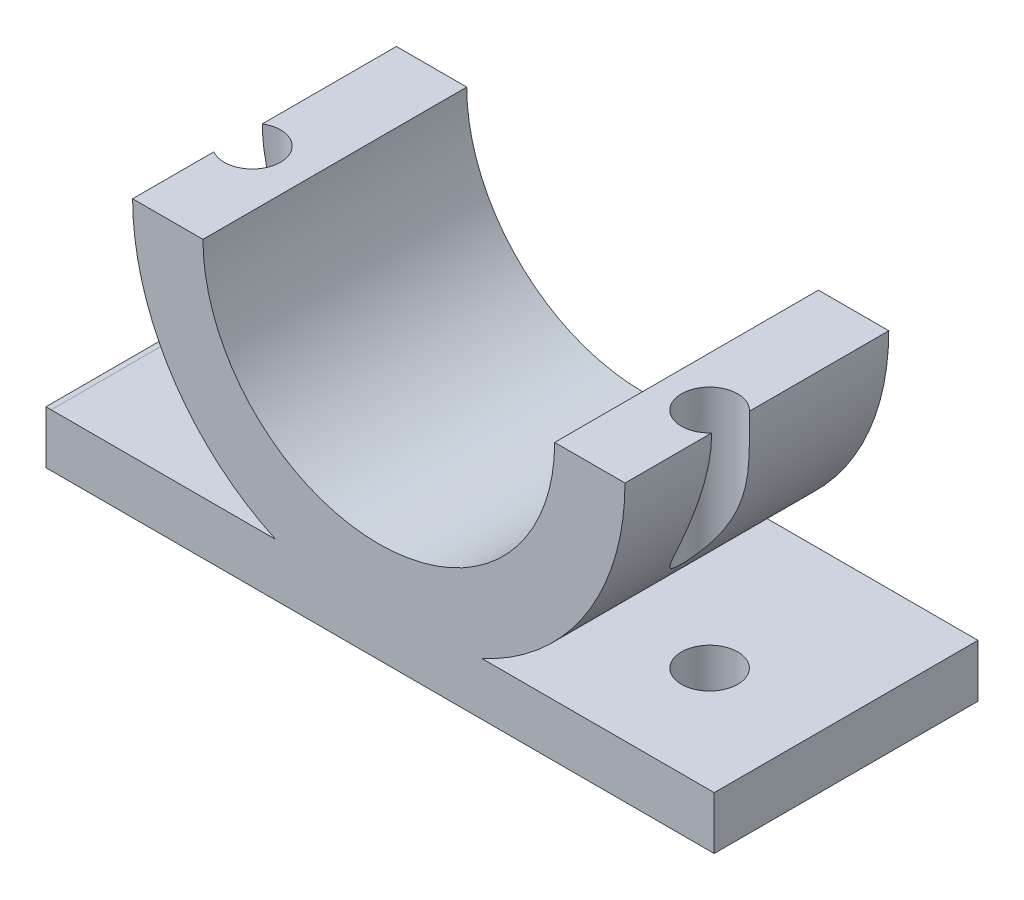
ISO-10303-21;
HEADER;
FILE_DESCRIPTION(('STEP AP214'),'2;1');
FILE_NAME('part.step','',(''),(''),'','','');
FILE_SCHEMA(('AUTOMOTIVE_DESIGN { 1 0 10303 214 1 1 1 1 }'));
ENDSEC;
DATA;
#1=APPLICATION_CONTEXT('core data for automotive mechanical design processes');
#2=APPLICATION_PROTOCOL_DEFINITION('international standard','automotive_design',2000,#1);
#3=PRODUCT_CONTEXT('',#1,'mechanical');
#4=PRODUCT('Part','Part','',(#3));
#5=PRODUCT_RELATED_PRODUCT_CATEGORY('part','',(#4));
#6=PRODUCT_DEFINITION_FORMATION('','',#4);
#7=PRODUCT_DEFINITION_CONTEXT('part definition',#1,'design');
#8=PRODUCT_DEFINITION('design','',#6,#7);
#9=PRODUCT_DEFINITION_SHAPE('','',#8);
#10=(LENGTH_UNIT() NAMED_UNIT(*) SI_UNIT(.MILLI.,.METRE.));
#11=(NAMED_UNIT(*) PLANE_ANGLE_UNIT() SI_UNIT($,.RADIAN.));
#12=(NAMED_UNIT(*) SI_UNIT($,.STERADIAN.) SOLID_ANGLE_UNIT());
#13=UNCERTAINTY_MEASURE_WITH_UNIT(LENGTH_MEASURE(1.E-05),#10,'distance_accuracy_value','');
#14=(GEOMETRIC_REPRESENTATION_CONTEXT(3) GLOBAL_UNCERTAINTY_ASSIGNED_CONTEXT((#13)) GLOBAL_UNIT_ASSIGNED_CONTEXT((#10,
#11,#12)) REPRESENTATION_CONTEXT('',''));
#15=CARTESIAN_POINT('',(0.,0.,0.));
#16=DIRECTION('',(0.,0.,1.));
#17=DIRECTION('',(1.,0.,0.));
#18=AXIS2_PLACEMENT_3D('',#15,#16,#17);
#19=CARTESIAN_POINT('',(0.,0.,15.));
#20=DIRECTION('',(0.,0.,-1.));
#21=DIRECTION('',(-1.,0.,0.));
#22=AXIS2_PLACEMENT_3D('',#19,#20,#21);
#23=CYLINDRICAL_SURFACE('',#22,14.);
#24=DIRECTION('',(0.,0.,-1.));
#25=VECTOR('',#24,1.);
#26=CARTESIAN_POINT('',(-14.,0.,15.));
#27=LINE('',#26,#25);
#28=CARTESIAN_POINT('',(-14.,0.,15.));
#29=VERTEX_POINT('',#28);
#30=CARTESIAN_POINT('',(-14.,0.,10.3798664609365));
#31=VERTEX_POINT('',#30);
#32=EDGE_CURVE('E152',#29,#31,#27,.T.);
#33=ORIENTED_EDGE('',*,*,#32,.T.);
#34=CARTESIAN_POINT('',(-14.,0.,10.3798664609365));
#35=CARTESIAN_POINT('',(-14.0000011574879,-0.133534707204342,10.3798439400469));
#36=CARTESIAN_POINT('',(-13.998089519456,-0.267066187434586,10.3809873730725));
#37=CARTESIAN_POINT('',(-13.9904498870322,-0.533971822410047,10.3854404779591));
#38=CARTESIAN_POINT('',(-13.9847222471957,-0.667345990618352,10.388749948567));
#39=CARTESIAN_POINT('',(-13.9694633795974,-0.933749242228249,10.3973675194615));
#40=CARTESIAN_POINT('',(-13.9599339159343,-1.06677845691807,10.402674692722));
#41=CARTESIAN_POINT('',(-13.9370873397942,-1.33243079980402,10.4149730651283));
#42=CARTESIAN_POINT('',(-13.9237701410927,-1.46505391868624,10.4219643026097));
#43=CARTESIAN_POINT('',(-13.8775966092046,-1.86707626292814,10.4451779981575));
#44=CARTESIAN_POINT('',(-13.8387989737457,-2.13569561566853,10.4634551517566));
#45=CARTESIAN_POINT('',(-13.7456949377816,-2.67010251195442,10.5012683347799));
#46=CARTESIAN_POINT('',(-13.6913893462134,-2.93589020245718,10.5208042985001));
#47=CARTESIAN_POINT('',(-13.5673032964662,-3.46439694041123,10.5562372083197));
#48=CARTESIAN_POINT('',(-13.4975060780449,-3.72711233743451,10.5721301749501));
#49=CARTESIAN_POINT('',(-13.3424959092101,-4.24874456039966,10.5946580252902));
#50=CARTESIAN_POINT('',(-13.2572690168224,-4.5076577200705,10.6012844883214));
#51=CARTESIAN_POINT('',(-13.1186644156227,-4.89069257240535,10.5990597889276));
#52=CARTESIAN_POINT('',(-13.0709177106255,-5.01690169281438,10.5963316471661));
#53=CARTESIAN_POINT('',(-12.9718749843762,-5.26769594886824,10.5858345572495));
#54=CARTESIAN_POINT('',(-12.9205797693436,-5.39228144580493,10.5780667507648));
#55=CARTESIAN_POINT('',(-12.8147208782103,-5.63923253301327,10.5562838171232));
#56=CARTESIAN_POINT('',(-12.7601637075649,-5.76160194677408,10.5422807875574));
#57=CARTESIAN_POINT('',(-12.6480262114857,-6.0037660911204,10.5065336869667));
#58=CARTESIAN_POINT('',(-12.5904476654659,-6.12356227987078,10.4847941296349));
#59=CARTESIAN_POINT('',(-12.4945146449322,-6.31617334121338,10.4414715116981));
#60=CARTESIAN_POINT('',(-12.456905886717,-6.39001373645327,10.4227904055934));
#61=CARTESIAN_POINT('',(-12.3809038996368,-6.53605314468835,10.3809836133814));
#62=CARTESIAN_POINT('',(-12.3425105028028,-6.60825179909444,10.3578569665111));
#63=CARTESIAN_POINT('',(-12.2653141111791,-6.75045202237888,10.306503961957));
#64=CARTESIAN_POINT('',(-12.2265118353443,-6.82045679276315,10.2782854844545));
#65=CARTESIAN_POINT('',(-12.1489114623974,-6.9577411685838,10.2159120952374));
#66=CARTESIAN_POINT('',(-12.1101133760865,-7.02502234214537,10.1817606611635));
#67=CARTESIAN_POINT('',(-12.0278071781276,-7.16514676494324,10.1013095875898));
#68=CARTESIAN_POINT('',(-11.9843927483605,-7.23746589121089,10.0539817322625));
#69=CARTESIAN_POINT('',(-11.8999043854749,-7.37555400430604,9.94868077485563));
#70=CARTESIAN_POINT('',(-11.8588286244099,-7.44132813774581,9.89071614060321));
#71=CARTESIAN_POINT('',(-11.7909690748889,-7.54824719449067,9.77825023347896));
#72=CARTESIAN_POINT('',(-11.7631497480787,-7.59147763172099,9.7263815688545));
#73=CARTESIAN_POINT('',(-11.7118411282407,-7.67039654491171,9.61525142724648));
#74=CARTESIAN_POINT('',(-11.6883443002495,-7.70609816129727,9.55600312277713));
#75=CARTESIAN_POINT('',(-11.652396247202,-7.76031376259909,9.44507175288739));
#76=CARTESIAN_POINT('',(-11.6386470949014,-7.78089385681417,9.39482848885588));
#77=CARTESIAN_POINT('',(-11.6158590544983,-7.81487299663817,9.29093655119338));
#78=CARTESIAN_POINT('',(-11.6068165008687,-7.82827763076993,9.23729056426502));
#79=CARTESIAN_POINT('',(-11.5942161836417,-7.84692834717347,9.12758613198518));
#80=CARTESIAN_POINT('',(-11.5906929559184,-7.85212305958255,9.07151473460531));
#81=CARTESIAN_POINT('',(-11.5896166639381,-7.85371171374822,8.95919156368826));
#82=CARTESIAN_POINT('',(-11.5920625336291,-7.8501072269992,8.90293982415124));
#83=CARTESIAN_POINT('',(-11.6021536866617,-7.83518321357694,8.79743793569096));
#84=CARTESIAN_POINT('',(-11.6092883779132,-7.82462109915302,8.7480268264321));
#85=CARTESIAN_POINT('',(-11.62766471831,-7.79728694063678,8.65177657770333));
#86=CARTESIAN_POINT('',(-11.6389078430523,-7.78051266533731,8.60493836928556));
#87=CARTESIAN_POINT('',(-11.669834787478,-7.7340802536774,8.49688744616331));
#88=CARTESIAN_POINT('',(-11.6911003971379,-7.70194877985743,8.4371928852027));
#89=CARTESIAN_POINT('',(-11.7382602387575,-7.62988282130522,8.32475636219623));
#90=CARTESIAN_POINT('',(-11.7641646030274,-7.58993123716428,8.27203006795807));
#91=CARTESIAN_POINT('',(-11.8333186237642,-7.48187858347753,8.14759855635788));
#92=CARTESIAN_POINT('',(-11.8785663196592,-7.4099664042589,8.08034477645579));
#93=CARTESIAN_POINT('',(-11.9723185721334,-7.25752452407092,7.95936037561526));
#94=CARTESIAN_POINT('',(-12.0208300050482,-7.17697640196118,7.90565951601192));
#95=CARTESIAN_POINT('',(-12.1136954005995,-7.01896613329261,7.8146100229189));
#96=CARTESIAN_POINT('',(-12.15794583979,-6.94207994962156,7.77613213475118));
#97=CARTESIAN_POINT('',(-12.2463658204819,-6.78488520674361,7.70672379208829));
#98=CARTESIAN_POINT('',(-12.290535267185,-6.70457392070378,7.67579948815266));
#99=CARTESIAN_POINT('',(-12.3782021268203,-6.5413082861033,7.62030982994417));
#100=CARTESIAN_POINT('',(-12.4216985481636,-6.45835050399302,7.59575314790534));
#101=CARTESIAN_POINT('',(-12.5075736473815,-6.29042935153647,7.55206910040736));
#102=CARTESIAN_POINT('',(-12.549951886318,-6.20546521769324,7.5329438390947));
#103=CARTESIAN_POINT('',(-12.6348857715784,-6.03070923251728,7.49868927989214));
#104=CARTESIAN_POINT('',(-12.6773872714671,-5.94085645277399,7.48373889651386));
#105=CARTESIAN_POINT('',(-12.7606870402736,-5.75975786077782,7.45808023315451));
#106=CARTESIAN_POINT('',(-12.8014849349062,-5.66851174835843,7.44737288103375));
#107=CARTESIAN_POINT('',(-12.9211658582061,-5.3929187134401,7.42063486091828));
#108=CARTESIAN_POINT('',(-12.997279371575,-5.20683370682074,7.41000921112078));
#109=CARTESIAN_POINT('',(-13.1418249461726,-4.830458106269,7.39908323391034));
#110=CARTESIAN_POINT('',(-13.2102174103034,-4.64015133602523,7.39883391717796));
#111=CARTESIAN_POINT('',(-13.3386368431013,-4.25694582181597,7.40561557805176));
#112=CARTESIAN_POINT('',(-13.3986661106721,-4.06404780618951,7.41264455047965));
#113=CARTESIAN_POINT('',(-13.4999811591409,-3.71182233181233,7.42962152594024));
#114=CARTESIAN_POINT('',(-13.5426824011609,-3.55285966557051,7.43879283475815));
#115=CARTESIAN_POINT('',(-13.6224323555281,-3.23363724056276,7.45897415853759));
#116=CARTESIAN_POINT('',(-13.6594805999655,-3.07337737558,7.46998432554723));
#117=CARTESIAN_POINT('',(-13.7621299839042,-2.59074758857452,7.50400905930614));
#118=CARTESIAN_POINT('',(-13.8192220079928,-2.26657535838244,7.52801483110056));
#119=CARTESIAN_POINT('',(-13.8872988994474,-1.78022299948646,7.55969179393994));
#120=CARTESIAN_POINT('',(-13.9069776532434,-1.61933980711758,7.56946921036134));
#121=CARTESIAN_POINT('',(-13.9407465556361,-1.29686601325476,7.58689543486728));
#122=CARTESIAN_POINT('',(-13.9548369242459,-1.13527543986348,7.59454432674763));
#123=CARTESIAN_POINT('',(-13.9774002412711,-0.811549392780131,7.60705191532933));
#124=CARTESIAN_POINT('',(-13.985871659475,-0.649413782730317,7.6119098519203));
#125=CARTESIAN_POINT('',(-13.9971732146452,-0.324854958417863,7.61847511775139));
#126=CARTESIAN_POINT('',(-14.0000023574346,-0.16243169851636,7.62018189174832));
#127=CARTESIAN_POINT('',(-14.,0.,7.62013353906578));
#128=B_SPLINE_CURVE_WITH_KNOTS('',3,(#34,#35,#36,#37,#38,#39,#40,#41,#42,#43,#44,#45,#46,#47,
#48,#49,#50,#51,#52,#53,#54,#55,#56,#57,#58,#59,#60,#61,#62,#63,#64,#65,#66,#67,#68,#69,#70,#71,
#72,#73,#74,#75,#76,#77,#78,#79,#80,#81,#82,#83,#84,#85,#86,#87,#88,#89,#90,#91,#92,#93,#94,#95,
#96,#97,#98,#99,#100,#101,#102,#103,#104,#105,#106,#107,#108,#109,#110,#111,#112,#113,#114,#115,
#116,#117,#118,#119,#120,#121,#122,#123,#124,#125,#126,#127),.UNSPECIFIED.,.F.,.F.,(4,2,2,2,2,2,
2,2,2,2,2,2,2,2,2,2,2,2,2,2,2,2,2,2,2,2,2,2,2,2,2,2,2,2,2,2,2,2,2,2,2,2,2,2,2,2,4),(0.,
0.400580183800321,0.801123153752593,1.20148048199816,1.60184692476492,2.4173873010531,
3.23288514431159,4.04926960515134,4.86639545174238,5.27117648963018,5.67586586163174,
6.07977345284364,6.48344577907092,6.73817262351038,6.99295458111618,7.24734556501984,
7.5015879360474,7.79111793965988,8.08041844362935,8.29881939378953,8.51683594397542,
8.68420754462032,8.85144859949342,9.01973200428561,9.18798535667484,9.34041589240145,
9.4929012294244,9.70485667153961,9.91728085855179,10.2405395889441,10.5645021163037,
10.8541700946246,11.1440731567119,11.434368996026,11.724777143766,12.0261915353285,
12.3276718034547,12.9310251066318,13.5373441825553,14.1434962612038,14.6379381033609,
15.1324208492732,16.121535767073,16.608584024125,17.0956131043329,17.5827747630097,
18.0700222526708),.UNSPECIFIED.);
#129=CARTESIAN_POINT('',(-14.,0.,7.62013353906578));
#130=VERTEX_POINT('',#129);
#131=EDGE_CURVE('E66',#31,#130,#128,.T.);
#132=ORIENTED_EDGE('',*,*,#131,.T.);
#133=CARTESIAN_POINT('',(-14.,0.,0.));
#134=VERTEX_POINT('',#133);
#135=EDGE_CURVE('E149',#130,#134,#27,.T.);
#136=ORIENTED_EDGE('',*,*,#135,.T.);
#137=CARTESIAN_POINT('',(0.,0.,0.));
#138=DIRECTION('',(0.,0.,1.));
#139=DIRECTION('',(1.,0.,0.));
#140=AXIS2_PLACEMENT_3D('',#137,#138,#139);
#141=CIRCLE('',#140,14.);
#142=CARTESIAN_POINT('',(-5.86854837995793,-12.7106309800927,0.));
#143=VERTEX_POINT('',#142);
#144=EDGE_CURVE('E215',#134,#143,#141,.T.);
#145=ORIENTED_EDGE('',*,*,#144,.T.);
#146=DIRECTION('',(0.,0.,-1.));
#147=VECTOR('',#146,1.);
#148=CARTESIAN_POINT('',(-5.86854837995793,-12.7106309800927,15.));
#149=LINE('',#148,#147);
#150=CARTESIAN_POINT('',(-5.86854837995793,-12.7106309800927,15.));
#151=VERTEX_POINT('',#150);
#152=EDGE_CURVE('E54',#151,#143,#149,.T.);
#153=ORIENTED_EDGE('',*,*,#152,.F.);
#154=CARTESIAN_POINT('',(0.,0.,15.));
#155=DIRECTION('',(0.,0.,1.));
#156=DIRECTION('',(1.,0.,0.));
#157=AXIS2_PLACEMENT_3D('',#154,#155,#156);
#158=CIRCLE('',#157,14.);
#159=EDGE_CURVE('E254',#29,#151,#158,.T.);
#160=ORIENTED_EDGE('',*,*,#159,.F.);
#161=EDGE_LOOP('',(#33,#132,#136,#145,#153,#160));
#162=FACE_BOUND('',#161,.T.);
#163=ADVANCED_FACE('F45',(#162),#23,.T.);
#164=CARTESIAN_POINT('',(-5.86854837995793,-12.7106309800927,15.));
#165=DIRECTION('',(0.,-1.,0.));
#166=DIRECTION('',(1.,0.,0.));
#167=AXIS2_PLACEMENT_3D('',#164,#165,#166);
#168=PLANE('',#167);
#169=CARTESIAN_POINT('',(-13.1900811460487,-12.7106309800927,9.00000000000112));
#170=DIRECTION('',(0.,-1.,0.));
#171=DIRECTION('',(1.,0.,0.));
#172=AXIS2_PLACEMENT_3D('',#169,#170,#171);
#173=CIRCLE('',#172,1.6);
#174=CARTESIAN_POINT('',(-11.5900811460487,-12.7106309800927,9.00000000000112));
#175=VERTEX_POINT('',#174);
#176=EDGE_CURVE('E154',#175,#175,#173,.T.);
#177=ORIENTED_EDGE('',*,*,#176,.T.);
#178=EDGE_LOOP('',(#177));
#179=FACE_BOUND('',#178,.T.);
#180=DIRECTION('',(-1.,0.,0.));
#181=VECTOR('',#180,1.);
#182=CARTESIAN_POINT('',(-5.86854837995793,-12.7106309800927,0.));
#183=LINE('',#182,#181);
#184=CARTESIAN_POINT('',(-18.6318689276398,-12.7106309800927,0.));
#185=VERTEX_POINT('',#184);
#186=EDGE_CURVE('E212',#143,#185,#183,.T.);
#187=ORIENTED_EDGE('',*,*,#186,.T.);
#188=DIRECTION('',(0.,0.,-1.));
#189=VECTOR('',#188,1.);
#190=CARTESIAN_POINT('',(-18.6318689276398,-12.7106309800927,15.));
#191=LINE('',#190,#189);
#192=CARTESIAN_POINT('',(-18.6318689276398,-12.7106309800927,15.));
#193=VERTEX_POINT('',#192);
#194=EDGE_CURVE('E203',#193,#185,#191,.T.);
#195=ORIENTED_EDGE('',*,*,#194,.F.);
#196=DIRECTION('',(-1.,0.,0.));
#197=VECTOR('',#196,1.);
#198=CARTESIAN_POINT('',(-5.86854837995793,-12.7106309800927,15.));
#199=LINE('',#198,#197);
#200=EDGE_CURVE('E213',#151,#193,#199,.T.);
#201=ORIENTED_EDGE('',*,*,#200,.F.);
#202=ORIENTED_EDGE('',*,*,#152,.T.);
#203=EDGE_LOOP('',(#187,#195,#201,#202));
#204=FACE_BOUND('',#203,.T.);
#205=ADVANCED_FACE('F210',(#179,#204),#168,.F.);
#206=CARTESIAN_POINT('',(-18.6318689276398,-12.7106309800927,15.));
#207=DIRECTION('',(-0.0175736693368751,-0.999845571148884,0.));
#208=DIRECTION('',(0.999845571148884,-0.0175736693368751,0.));
#209=AXIS2_PLACEMENT_3D('',#206,#207,#208);
#210=PLANE('',#209);
#211=DIRECTION('',(-0.999845571148884,0.0175736693368751,0.));
#212=VECTOR('',#211,1.);
#213=CARTESIAN_POINT('',(-18.6318689276398,-12.7106309800927,0.));
#214=LINE('',#213,#212);
#215=CARTESIAN_POINT('',(-18.9258572809972,-12.7054637280091,0.));
#216=VERTEX_POINT('',#215);
#217=EDGE_CURVE('E222',#185,#216,#214,.T.);
#218=ORIENTED_EDGE('',*,*,#217,.T.);
#219=DIRECTION('',(0.,0.,-1.));
#220=VECTOR('',#219,1.);
#221=CARTESIAN_POINT('',(-18.9258572809972,-12.7054637280091,15.));
#222=LINE('',#221,#220);
#223=CARTESIAN_POINT('',(-18.9258572809972,-12.7054637280091,15.));
#224=VERTEX_POINT('',#223);
#225=EDGE_CURVE('E199',#224,#216,#222,.T.);
#226=ORIENTED_EDGE('',*,*,#225,.F.);
#227=DIRECTION('',(-0.999845571148884,0.0175736693368751,0.));
#228=VECTOR('',#227,1.);
#229=CARTESIAN_POINT('',(-18.6318689276398,-12.7106309800927,15.));
#230=LINE('',#229,#228);
#231=EDGE_CURVE('E259',#193,#224,#230,.T.);
#232=ORIENTED_EDGE('',*,*,#231,.F.);
#233=ORIENTED_EDGE('',*,*,#194,.T.);
#234=EDGE_LOOP('',(#218,#226,#232,#233));
#235=FACE_BOUND('',#234,.T.);
#236=ADVANCED_FACE('F323',(#235),#210,.F.);
#237=CARTESIAN_POINT('',(-18.9258572809972,-12.7054637280091,15.));
#238=DIRECTION('',(1.,0.,0.));
#239=DIRECTION('',(0.,0.,-1.));
#240=AXIS2_PLACEMENT_3D('',#237,#238,#239);
#241=PLANE('',#240);
#242=DIRECTION('',(0.,-1.,0.));
#243=VECTOR('',#242,1.);
#244=CARTESIAN_POINT('',(-18.9258572809972,-12.7054637280091,0.));
#245=LINE('',#244,#243);
#246=CARTESIAN_POINT('',(-18.9258572809972,-15.7106309800927,0.));
#247=VERTEX_POINT('',#246);
#248=EDGE_CURVE('E230',#216,#247,#245,.T.);
#249=ORIENTED_EDGE('',*,*,#248,.T.);
#250=DIRECTION('',(0.,0.,-1.));
#251=VECTOR('',#250,1.);
#252=CARTESIAN_POINT('',(-18.9258572809972,-15.7106309800927,15.));
#253=LINE('',#252,#251);
#254=CARTESIAN_POINT('',(-18.9258572809972,-15.7106309800927,15.));
#255=VERTEX_POINT('',#254);
#256=EDGE_CURVE('E195',#255,#247,#253,.T.);
#257=ORIENTED_EDGE('',*,*,#256,.F.);
#258=DIRECTION('',(0.,-1.,0.));
#259=VECTOR('',#258,1.);
#260=CARTESIAN_POINT('',(-18.9258572809972,-12.7054637280091,15.));
#261=LINE('',#260,#259);
#262=EDGE_CURVE('E265',#224,#255,#261,.T.);
#263=ORIENTED_EDGE('',*,*,#262,.F.);
#264=ORIENTED_EDGE('',*,*,#225,.T.);
#265=EDGE_LOOP('',(#249,#257,#263,#264));
#266=FACE_BOUND('',#265,.T.);
#267=ADVANCED_FACE('F319',(#266),#241,.F.);
#268=CARTESIAN_POINT('',(-18.9258572809972,-15.7106309800927,15.));
#269=DIRECTION('',(0.,1.,0.));
#270=DIRECTION('',(0.,0.,1.));
#271=AXIS2_PLACEMENT_3D('',#268,#269,#270);
#272=PLANE('',#271);
#273=CARTESIAN_POINT('',(-13.1900811460487,-15.7106309800927,9.00000000000112));
#274=DIRECTION('',(0.,1.,0.));
#275=DIRECTION('',(-1.,0.,0.));
#276=AXIS2_PLACEMENT_3D('',#273,#274,#275);
#277=CIRCLE('',#276,1.6);
#278=CARTESIAN_POINT('',(-14.7900811460487,-15.7106309800927,9.00000000000112));
#279=VERTEX_POINT('',#278);
#280=EDGE_CURVE('E144',#279,#279,#277,.T.);
#281=ORIENTED_EDGE('',*,*,#280,.T.);
#282=EDGE_LOOP('',(#281));
#283=FACE_BOUND('',#282,.T.);
#284=CARTESIAN_POINT('',(12.8099188539513,-15.7106309800927,9.00000000000112));
#285=DIRECTION('',(0.,1.,0.));
#286=DIRECTION('',(-1.,0.,0.));
#287=AXIS2_PLACEMENT_3D('',#284,#285,#286);
#288=CIRCLE('',#287,1.6);
#289=CARTESIAN_POINT('',(11.2099188539513,-15.7106309800927,9.00000000000112));
#290=VERTEX_POINT('',#289);
#291=EDGE_CURVE('E145',#290,#290,#288,.T.);
#292=ORIENTED_EDGE('',*,*,#291,.T.);
#293=EDGE_LOOP('',(#292));
#294=FACE_BOUND('',#293,.T.);
#295=DIRECTION('',(1.,0.,0.));
#296=VECTOR('',#295,1.);
#297=CARTESIAN_POINT('',(-18.9258572809972,-15.7106309800927,0.));
#298=LINE('',#297,#296);
#299=CARTESIAN_POINT('',(19.0741427190027,-15.7106309800927,0.));
#300=VERTEX_POINT('',#299);
#301=EDGE_CURVE('E233',#247,#300,#298,.T.);
#302=ORIENTED_EDGE('',*,*,#301,.T.);
#303=DIRECTION('',(0.,0.,-1.));
#304=VECTOR('',#303,1.);
#305=CARTESIAN_POINT('',(19.0741427190027,-15.7106309800927,15.));
#306=LINE('',#305,#304);
#307=CARTESIAN_POINT('',(19.0741427190027,-15.7106309800927,15.));
#308=VERTEX_POINT('',#307);
#309=EDGE_CURVE('E191',#308,#300,#306,.T.);
#310=ORIENTED_EDGE('',*,*,#309,.F.);
#311=DIRECTION('',(1.,0.,0.));
#312=VECTOR('',#311,1.);
#313=CARTESIAN_POINT('',(-18.9258572809972,-15.7106309800927,15.));
#314=LINE('',#313,#312);
#315=EDGE_CURVE('E268',#255,#308,#314,.T.);
#316=ORIENTED_EDGE('',*,*,#315,.F.);
#317=ORIENTED_EDGE('',*,*,#256,.T.);
#318=EDGE_LOOP('',(#302,#310,#316,#317));
#319=FACE_BOUND('',#318,.T.);
#320=ADVANCED_FACE('F315',(#283,#294,#319),#272,.F.);
#321=CARTESIAN_POINT('',(19.0741427190027,-15.7106309800927,15.));
#322=DIRECTION('',(-1.,0.,0.));
#323=DIRECTION('',(0.,-1.,0.));
#324=AXIS2_PLACEMENT_3D('',#321,#322,#323);
#325=PLANE('',#324);
#326=DIRECTION('',(0.,1.,0.));
#327=VECTOR('',#326,1.);
#328=CARTESIAN_POINT('',(19.0741427190027,-15.7106309800927,0.));
#329=LINE('',#328,#327);
#330=CARTESIAN_POINT('',(19.0741427190027,-12.7106309800927,0.));
#331=VERTEX_POINT('',#330);
#332=EDGE_CURVE('E236',#300,#331,#329,.T.);
#333=ORIENTED_EDGE('',*,*,#332,.T.);
#334=DIRECTION('',(0.,0.,-1.));
#335=VECTOR('',#334,1.);
#336=CARTESIAN_POINT('',(19.0741427190027,-12.7106309800927,15.));
#337=LINE('',#336,#335);
#338=CARTESIAN_POINT('',(19.0741427190027,-12.7106309800927,15.));
#339=VERTEX_POINT('',#338);
#340=EDGE_CURVE('E187',#339,#331,#337,.T.);
#341=ORIENTED_EDGE('',*,*,#340,.F.);
#342=DIRECTION('',(0.,1.,0.));
#343=VECTOR('',#342,1.);
#344=CARTESIAN_POINT('',(19.0741427190027,-15.7106309800927,15.));
#345=LINE('',#344,#343);
#346=EDGE_CURVE('E271',#308,#339,#345,.T.);
#347=ORIENTED_EDGE('',*,*,#346,.F.);
#348=ORIENTED_EDGE('',*,*,#309,.T.);
#349=EDGE_LOOP('',(#333,#341,#347,#348));
#350=FACE_BOUND('',#349,.T.);
#351=ADVANCED_FACE('F310',(#350),#325,.F.);
#352=CARTESIAN_POINT('',(19.0741427190027,-12.7106309800927,15.));
#353=DIRECTION('',(0.,-1.,0.));
#354=DIRECTION('',(1.,0.,0.));
#355=AXIS2_PLACEMENT_3D('',#352,#353,#354);
#356=PLANE('',#355);
#357=CARTESIAN_POINT('',(12.8099188539513,-12.7106309800927,9.00000000000112));
#358=DIRECTION('',(0.,-1.,0.));
#359=DIRECTION('',(1.,0.,0.));
#360=AXIS2_PLACEMENT_3D('',#357,#358,#359);
#361=CIRCLE('',#360,1.6);
#362=CARTESIAN_POINT('',(14.4099188539513,-12.7106309800927,9.00000000000112));
#363=VERTEX_POINT('',#362);
#364=EDGE_CURVE('E218',#363,#363,#361,.T.);
#365=ORIENTED_EDGE('',*,*,#364,.T.);
#366=EDGE_LOOP('',(#365));
#367=FACE_BOUND('',#366,.T.);
#368=DIRECTION('',(-1.,0.,0.));
#369=VECTOR('',#368,1.);
#370=CARTESIAN_POINT('',(19.0741427190027,-12.7106309800927,0.));
#371=LINE('',#370,#369);
#372=CARTESIAN_POINT('',(5.86854837995793,-12.7106309800927,0.));
#373=VERTEX_POINT('',#372);
#374=EDGE_CURVE('E239',#331,#373,#371,.T.);
#375=ORIENTED_EDGE('',*,*,#374,.T.);
#376=DIRECTION('',(0.,0.,-1.));
#377=VECTOR('',#376,1.);
#378=CARTESIAN_POINT('',(5.86854837995793,-12.7106309800927,15.));
#379=LINE('',#378,#377);
#380=CARTESIAN_POINT('',(5.86854837995793,-12.7106309800927,15.));
#381=VERTEX_POINT('',#380);
#382=EDGE_CURVE('E183',#381,#373,#379,.T.);
#383=ORIENTED_EDGE('',*,*,#382,.F.);
#384=DIRECTION('',(-1.,0.,0.));
#385=VECTOR('',#384,1.);
#386=CARTESIAN_POINT('',(19.0741427190027,-12.7106309800927,15.));
#387=LINE('',#386,#385);
#388=EDGE_CURVE('E274',#339,#381,#387,.T.);
#389=ORIENTED_EDGE('',*,*,#388,.F.);
#390=ORIENTED_EDGE('',*,*,#340,.T.);
#391=EDGE_LOOP('',(#375,#383,#389,#390));
#392=FACE_BOUND('',#391,.T.);
#393=ADVANCED_FACE('F304',(#367,#392),#356,.F.);
#394=CARTESIAN_POINT('',(0.,0.,15.));
#395=DIRECTION('',(0.,0.,-1.));
#396=DIRECTION('',(-1.,0.,0.));
#397=AXIS2_PLACEMENT_3D('',#394,#395,#396);
#398=CYLINDRICAL_SURFACE('',#397,14.);
#399=DIRECTION('',(0.,0.,-1.));
#400=VECTOR('',#399,1.);
#401=CARTESIAN_POINT('',(14.,0.,15.));
#402=LINE('',#401,#400);
#403=CARTESIAN_POINT('',(14.,0.,7.93055768467065));
#404=VERTEX_POINT('',#403);
#405=CARTESIAN_POINT('',(14.,0.,0.));
#406=VERTEX_POINT('',#405);
#407=EDGE_CURVE('E178',#404,#406,#402,.T.);
#408=ORIENTED_EDGE('',*,*,#407,.F.);
#409=CARTESIAN_POINT('',(14.,0.,7.93055768467065));
#410=CARTESIAN_POINT('',(14.0000028757278,-0.134853860218294,7.93060714543473));
#411=CARTESIAN_POINT('',(13.9980516867444,-0.269695629963498,7.92838999125859));
#412=CARTESIAN_POINT('',(13.9902649204852,-0.539089576898368,7.91979503400132));
#413=CARTESIAN_POINT('',(13.9844306821792,-0.673641837878285,7.91341866513364));
#414=CARTESIAN_POINT('',(13.9689159455448,-0.942035216532712,7.89689273770998));
#415=CARTESIAN_POINT('',(13.9592426086808,-1.07587719074034,7.88675020681753));
#416=CARTESIAN_POINT('',(13.9360838047953,-1.34295812521179,7.86332731652322));
#417=CARTESIAN_POINT('',(13.9225980075508,-1.47619703222372,7.8500466853256));
#418=CARTESIAN_POINT('',(13.8761979491119,-1.87723237273372,7.80632347032658));
#419=CARTESIAN_POINT('',(13.8374790089845,-2.14396644559377,7.77217040047652));
#420=CARTESIAN_POINT('',(13.7448324672943,-2.67434172809129,7.70024246858549));
#421=CARTESIAN_POINT('',(13.6908987143033,-2.93798164174504,7.66246614573008));
#422=CARTESIAN_POINT('',(13.5680423628363,-3.4612473753283,7.5891997877338));
#423=CARTESIAN_POINT('',(13.4991643356571,-3.72088272399621,7.55370335231828));
#424=CARTESIAN_POINT('',(13.3462355674347,-4.23678678528198,7.4902862758142));
#425=CARTESIAN_POINT('',(13.2621793021876,-4.4930542355837,7.46236840227687));
#426=CARTESIAN_POINT('',(13.1249907156334,-4.87367574461958,7.43063266187048));
#427=CARTESIAN_POINT('',(13.0775193703387,-4.99966455498088,7.42175217511838));
#428=CARTESIAN_POINT('',(12.9788817015169,-5.25040681963788,7.40816700120759));
#429=CARTESIAN_POINT('',(12.9277159661172,-5.37516046698504,7.40346165096721));
#430=CARTESIAN_POINT('',(12.8218201539696,-5.6230843758327,7.39916781614834));
#431=CARTESIAN_POINT('',(12.7670940488652,-5.74625622417345,7.39957372404762));
#432=CARTESIAN_POINT('',(12.654184935183,-5.99080366413239,7.40659246181868));
#433=CARTESIAN_POINT('',(12.5960030326513,-6.11217981510319,7.41320331568525));
#434=CARTESIAN_POINT('',(12.484879665491,-6.33569883278216,7.43249779662138));
#435=CARTESIAN_POINT('',(12.4323600619743,-6.43813507141365,7.44419085932699));
#436=CARTESIAN_POINT('',(12.3252008608406,-6.64097717485727,7.47417341473774));
#437=CARTESIAN_POINT('',(12.2705606810377,-6.74138247041692,7.49246473053331));
#438=CARTESIAN_POINT('',(12.1598173136146,-6.9391376683038,7.53681387045609));
#439=CARTESIAN_POINT('',(12.1037207153829,-7.03649802261312,7.56284090702174));
#440=CARTESIAN_POINT('',(11.9905757780874,-7.22761346492401,7.62420264105427));
#441=CARTESIAN_POINT('',(11.9335283756887,-7.32137183143174,7.65952863306396));
#442=CARTESIAN_POINT('',(11.8257110728452,-7.49411588433686,7.7369676166166));
#443=CARTESIAN_POINT('',(11.7749301611821,-7.57360200751957,7.77793186026829));
#444=CARTESIAN_POINT('',(11.6746089379637,-7.72734946633671,7.87051461948989));
#445=CARTESIAN_POINT('',(11.6250709320789,-7.80160149626756,7.92215149963532));
#446=CARTESIAN_POINT('',(11.5286710193307,-7.9433734063292,8.03863952986263));
#447=CARTESIAN_POINT('',(11.4818558565512,-8.01078541744839,8.10366430907953));
#448=CARTESIAN_POINT('',(11.395149121791,-8.13364530953222,8.24804288520506));
#449=CARTESIAN_POINT('',(11.3552277677885,-8.18914491973432,8.32733186145777));
#450=CARTESIAN_POINT('',(11.301495016018,-8.26301178455991,8.46375696501089));
#451=CARTESIAN_POINT('',(11.2837598267835,-8.28718416079489,8.51620913715887));
#452=CARTESIAN_POINT('',(11.2533925517309,-8.32837368938996,8.62527401743069));
#453=CARTESIAN_POINT('',(11.240756764261,-8.34539603232135,8.6818836722302));
#454=CARTESIAN_POINT('',(11.2215625344794,-8.37118890189976,8.79842641608342));
#455=CARTESIAN_POINT('',(11.2150480379232,-8.37989976585152,8.85838031207178));
#456=CARTESIAN_POINT('',(11.208910951568,-8.38810736780976,8.97926445413437));
#457=CARTESIAN_POINT('',(11.2092854615779,-8.38760798322262,9.04019427856086));
#458=CARTESIAN_POINT('',(11.2164982619712,-8.37795870467921,9.15487698158754));
#459=CARTESIAN_POINT('',(11.2226975277002,-8.36966400296491,9.20874658387555));
#460=CARTESIAN_POINT('',(11.2401439073266,-8.3462193020807,9.31410572422361));
#461=CARTESIAN_POINT('',(11.2513928444219,-8.33106682687667,9.36559439522922));
#462=CARTESIAN_POINT('',(11.282037602704,-8.28953938011931,9.47957426427032));
#463=CARTESIAN_POINT('',(11.3028467575846,-8.26118904239575,9.54096280966884));
#464=CARTESIAN_POINT('',(11.349769286713,-8.19660504965572,9.65720064557513));
#465=CARTESIAN_POINT('',(11.3758920876569,-8.16035737609752,9.71203803564933));
#466=CARTESIAN_POINT('',(11.4442232056534,-8.0644005364717,9.83787574532277));
#467=CARTESIAN_POINT('',(11.4884295317998,-8.0014130939194,9.9052684866003));
#468=CARTESIAN_POINT('',(11.5809702864318,-7.86688209465922,10.0274153102802));
#469=CARTESIAN_POINT('',(11.6293130443463,-7.7953211520384,10.0821430280698));
#470=CARTESIAN_POINT('',(11.7197646822543,-7.65850605503589,10.1725815572252));
#471=CARTESIAN_POINT('',(11.7615997314008,-7.59413508115119,10.2099387262643));
#472=CARTESIAN_POINT('',(11.8457350067671,-7.46221728469489,10.2779985317519));
#473=CARTESIAN_POINT('',(11.8880355344122,-7.3946682986244,10.3086965526819));
#474=CARTESIAN_POINT('',(11.972538717151,-7.25705502873939,10.3643152515652));
#475=CARTESIAN_POINT('',(12.0147411485466,-7.18698731554789,10.3892276792882));
#476=CARTESIAN_POINT('',(12.0985958501054,-7.04491272620023,10.4339718550444));
#477=CARTESIAN_POINT('',(12.1402479035982,-6.97290511837392,10.4538016555543));
#478=CARTESIAN_POINT('',(12.2598970023472,-6.76167073998896,10.5049152985709));
#479=CARTESIAN_POINT('',(12.3367867987425,-6.62040144285388,10.530395731661));
#480=CARTESIAN_POINT('',(12.4862958540529,-6.33392477441718,10.5688269714258));
#481=CARTESIAN_POINT('',(12.558911079568,-6.18871386680602,10.5817661169087));
#482=CARTESIAN_POINT('',(12.6993706413769,-5.89512677325383,10.5977428508334));
#483=CARTESIAN_POINT('',(12.7672045618203,-5.74674454201109,10.6007594384351));
#484=CARTESIAN_POINT('',(12.8976357375754,-5.44771714309019,10.5989241031293));
#485=CARTESIAN_POINT('',(12.9602310776077,-5.29707117130391,10.5940693154677));
#486=CARTESIAN_POINT('',(13.0831508763776,-4.98603776361943,10.5777787586137));
#487=CARTESIAN_POINT('',(13.1431843970021,-4.82555356209304,10.5660114264613));
#488=CARTESIAN_POINT('',(13.2571971915563,-4.50288960831374,10.537333744456));
#489=CARTESIAN_POINT('',(13.3111751233042,-4.34070948884538,10.5204222575054));
#490=CARTESIAN_POINT('',(13.464101702138,-3.8515922436198,10.4641927137021));
#491=CARTESIAN_POINT('',(13.5539166173949,-3.52239892097231,10.4194025341721));
#492=CARTESIAN_POINT('',(13.7090825984168,-2.85951879006805,10.3265072322419));
#493=CARTESIAN_POINT('',(13.7744768373904,-2.5258410026168,10.2784081397087));
#494=CARTESIAN_POINT('',(13.8808903633011,-1.85373267856596,10.1907252181495));
#495=CARTESIAN_POINT('',(13.9219407851994,-1.51530878195018,10.1511305537747));
#496=CARTESIAN_POINT('',(13.958810387738,-1.07758090637205,10.1136330974677));
#497=CARTESIAN_POINT('',(13.9660016837035,-0.979993088567493,10.1061426850293));
#498=CARTESIAN_POINT('',(13.9783424551695,-0.784555195927097,10.0931003342481));
#499=CARTESIAN_POINT('',(13.9834919481898,-0.686705123348787,10.0875483792724));
#500=CARTESIAN_POINT('',(13.9917392797235,-0.49076578769066,10.0785821264689));
#501=CARTESIAN_POINT('',(13.9948359808953,-0.392676422185445,10.0751690137158));
#502=CARTESIAN_POINT('',(13.9989668691576,-0.196392329091275,10.0705918076128));
#503=CARTESIAN_POINT('',(14.0000008478246,-0.098197591858127,10.0694279415337));
#504=CARTESIAN_POINT('',(14.,0.,10.069442315332));
#505=B_SPLINE_CURVE_WITH_KNOTS('',3,(#409,#410,#411,#412,#413,#414,#415,#416,#417,#418,#419,
#420,#421,#422,#423,#424,#425,#426,#427,#428,#429,#430,#431,#432,#433,#434,#435,#436,#437,#438,
#439,#440,#441,#442,#443,#444,#445,#446,#447,#448,#449,#450,#451,#452,#453,#454,#455,#456,#457,
#458,#459,#460,#461,#462,#463,#464,#465,#466,#467,#468,#469,#470,#471,#472,#473,#474,#475,#476,
#477,#478,#479,#480,#481,#482,#483,#484,#485,#486,#487,#488,#489,#490,#491,#492,#493,#494,#495,
#496,#497,#498,#499,#500,#501,#502,#503,#504),.UNSPECIFIED.,.F.,.F.,(4,2,2,2,2,2,2,2,2,2,2,2,2,
2,2,2,2,2,2,2,2,2,2,2,2,2,2,2,2,2,2,2,2,2,2,2,2,2,2,2,2,2,2,2,2,2,2,4),(0.,0.404509698008346,
0.808879983455376,1.21249947451291,1.61615393650582,2.43062009536888,3.24541602024211,
4.05781442705219,4.87050910891406,5.27519639576118,5.67981939997114,6.08399853408897,
6.48804899840062,6.83498213775422,7.18201120788494,7.52767721377759,7.8730207593449,
8.18097840175579,8.48947043051642,8.8022486008811,9.11363975795318,9.29423558706443,
9.4747000849782,9.65645048494853,9.83812437188406,10.0019392656829,10.1658133529284,
10.3768893617558,10.5883431489299,10.89350990683,11.1993063238792,11.4550807879893,
11.711031969333,11.9673459250227,12.2237579468537,12.7114678487499,13.1996308012784,
13.68882627569,14.1781998307184,14.6932205582115,15.2083552120987,16.2396574724778,
17.2691277682681,18.2972785489487,18.5916640472566,18.8860470195319,19.1805929575766,
19.4751686558898),.UNSPECIFIED.);
#506=CARTESIAN_POINT('',(14.,0.,10.0694423153316));
#507=VERTEX_POINT('',#506);
#508=EDGE_CURVE('E60',#404,#507,#505,.T.);
#509=ORIENTED_EDGE('',*,*,#508,.T.);
#510=CARTESIAN_POINT('',(14.,0.,15.));
#511=VERTEX_POINT('',#510);
#512=EDGE_CURVE('E179',#511,#507,#402,.T.);
#513=ORIENTED_EDGE('',*,*,#512,.F.);
#514=CARTESIAN_POINT('',(0.,0.,15.));
#515=DIRECTION('',(0.,0.,1.));
#516=DIRECTION('',(1.,0.,0.));
#517=AXIS2_PLACEMENT_3D('',#514,#515,#516);
#518=CIRCLE('',#517,14.);
#519=EDGE_CURVE('E277',#381,#511,#518,.T.);
#520=ORIENTED_EDGE('',*,*,#519,.F.);
#521=ORIENTED_EDGE('',*,*,#382,.T.);
#522=CARTESIAN_POINT('',(0.,0.,0.));
#523=DIRECTION('',(0.,0.,1.));
#524=DIRECTION('',(1.,0.,0.));
#525=AXIS2_PLACEMENT_3D('',#522,#523,#524);
#526=CIRCLE('',#525,14.);
#527=EDGE_CURVE('E242',#373,#406,#526,.T.);
#528=ORIENTED_EDGE('',*,*,#527,.T.);
#529=EDGE_LOOP('',(#408,#509,#513,#520,#521,#528));
#530=FACE_BOUND('',#529,.T.);
#531=ADVANCED_FACE('F298',(#530),#398,.T.);
#532=CARTESIAN_POINT('',(10.,0.,15.));
#533=DIRECTION('',(0.,-1.,0.));
#534=DIRECTION('',(0.,0.,-1.));
#535=AXIS2_PLACEMENT_3D('',#532,#533,#534);
#536=PLANE('',#535);
#537=ORIENTED_EDGE('',*,*,#512,.T.);
#538=CARTESIAN_POINT('',(12.8099188539513,0.,9.00000000000112));
#539=DIRECTION('',(0.,-1.,0.));
#540=DIRECTION('',(0.,0.,-1.));
#541=AXIS2_PLACEMENT_3D('',#538,#539,#540);
#542=CIRCLE('',#541,1.6);
#543=EDGE_CURVE('E11',#507,#404,#542,.T.);
#544=ORIENTED_EDGE('',*,*,#543,.T.);
#545=ORIENTED_EDGE('',*,*,#407,.T.);
#546=DIRECTION('',(-1.,0.,0.));
#547=VECTOR('',#546,1.);
#548=CARTESIAN_POINT('',(10.,0.,0.));
#549=LINE('',#548,#547);
#550=CARTESIAN_POINT('',(10.,0.,0.));
#551=VERTEX_POINT('',#550);
#552=EDGE_CURVE('E246',#406,#551,#549,.T.);
#553=ORIENTED_EDGE('',*,*,#552,.T.);
#554=DIRECTION('',(0.,0.,-1.));
#555=VECTOR('',#554,1.);
#556=CARTESIAN_POINT('',(10.,0.,15.));
#557=LINE('',#556,#555);
#558=CARTESIAN_POINT('',(10.,0.,15.));
#559=VERTEX_POINT('',#558);
#560=EDGE_CURVE('E174',#559,#551,#557,.T.);
#561=ORIENTED_EDGE('',*,*,#560,.F.);
#562=DIRECTION('',(-1.,0.,0.));
#563=VECTOR('',#562,1.);
#564=CARTESIAN_POINT('',(10.,0.,15.));
#565=LINE('',#564,#563);
#566=EDGE_CURVE('E280',#511,#559,#565,.T.);
#567=ORIENTED_EDGE('',*,*,#566,.F.);
#568=EDGE_LOOP('',(#537,#544,#545,#553,#561,#567));
#569=FACE_BOUND('',#568,.T.);
#570=ADVANCED_FACE('F294',(#569),#536,.F.);
#571=CARTESIAN_POINT('',(0.,0.,15.));
#572=DIRECTION('',(0.,0.,-1.));
#573=DIRECTION('',(-1.,0.,0.));
#574=AXIS2_PLACEMENT_3D('',#571,#572,#573);
#575=CYLINDRICAL_SURFACE('',#574,10.);
#576=CARTESIAN_POINT('',(0.,0.,0.));
#577=DIRECTION('',(0.,0.,-1.));
#578=DIRECTION('',(1.,0.,0.));
#579=AXIS2_PLACEMENT_3D('',#576,#577,#578);
#580=CIRCLE('',#579,10.);
#581=CARTESIAN_POINT('',(-10.,0.,0.));
#582=VERTEX_POINT('',#581);
#583=EDGE_CURVE('E248',#551,#582,#580,.T.);
#584=ORIENTED_EDGE('',*,*,#583,.T.);
#585=DIRECTION('',(0.,0.,-1.));
#586=VECTOR('',#585,1.);
#587=CARTESIAN_POINT('',(-10.,0.,15.));
#588=LINE('',#587,#586);
#589=CARTESIAN_POINT('',(-10.,0.,15.));
#590=VERTEX_POINT('',#589);
#591=EDGE_CURVE('E166',#590,#582,#588,.T.);
#592=ORIENTED_EDGE('',*,*,#591,.F.);
#593=CARTESIAN_POINT('',(0.,0.,15.));
#594=DIRECTION('',(0.,0.,-1.));
#595=DIRECTION('',(1.,0.,0.));
#596=AXIS2_PLACEMENT_3D('',#593,#594,#595);
#597=CIRCLE('',#596,10.);
#598=EDGE_CURVE('E167',#559,#590,#597,.T.);
#599=ORIENTED_EDGE('',*,*,#598,.F.);
#600=ORIENTED_EDGE('',*,*,#560,.T.);
#601=EDGE_LOOP('',(#584,#592,#599,#600));
#602=FACE_BOUND('',#601,.T.);
#603=ADVANCED_FACE('F288',(#602),#575,.F.);
#604=CARTESIAN_POINT('',(-14.,0.,15.));
#605=DIRECTION('',(0.,-1.,0.));
#606=DIRECTION('',(0.,0.,-1.));
#607=AXIS2_PLACEMENT_3D('',#604,#605,#606);
#608=PLANE('',#607);
#609=ORIENTED_EDGE('',*,*,#135,.F.);
#610=CARTESIAN_POINT('',(-13.1900811460487,0.,9.00000000000112));
#611=DIRECTION('',(0.,1.,0.));
#612=DIRECTION('',(-1.,0.,0.));
#613=AXIS2_PLACEMENT_3D('',#610,#611,#612);
#614=CIRCLE('',#613,1.6);
#615=EDGE_CURVE('E137',#31,#130,#614,.T.);
#616=ORIENTED_EDGE('',*,*,#615,.F.);
#617=ORIENTED_EDGE('',*,*,#32,.F.);
#618=DIRECTION('',(-1.,0.,0.));
#619=VECTOR('',#618,1.);
#620=CARTESIAN_POINT('',(-14.,0.,15.));
#621=LINE('',#620,#619);
#622=EDGE_CURVE('E162',#590,#29,#621,.T.);
#623=ORIENTED_EDGE('',*,*,#622,.F.);
#624=ORIENTED_EDGE('',*,*,#591,.T.);
#625=DIRECTION('',(-1.,0.,0.));
#626=VECTOR('',#625,1.);
#627=CARTESIAN_POINT('',(-14.,0.,0.));
#628=LINE('',#627,#626);
#629=EDGE_CURVE('E159',#582,#134,#628,.T.);
#630=ORIENTED_EDGE('',*,*,#629,.T.);
#631=EDGE_LOOP('',(#609,#616,#617,#623,#624,#630));
#632=FACE_BOUND('',#631,.T.);
#633=ADVANCED_FACE('F156',(#632),#608,.F.);
#634=CARTESIAN_POINT('',(0.,0.,15.));
#635=DIRECTION('',(0.,0.,1.));
#636=DIRECTION('',(1.,0.,0.));
#637=AXIS2_PLACEMENT_3D('',#634,#635,#636);
#638=PLANE('',#637);
#639=ORIENTED_EDGE('',*,*,#159,.T.);
#640=ORIENTED_EDGE('',*,*,#200,.T.);
#641=ORIENTED_EDGE('',*,*,#231,.T.);
#642=ORIENTED_EDGE('',*,*,#262,.T.);
#643=ORIENTED_EDGE('',*,*,#315,.T.);
#644=ORIENTED_EDGE('',*,*,#346,.T.);
#645=ORIENTED_EDGE('',*,*,#388,.T.);
#646=ORIENTED_EDGE('',*,*,#519,.T.);
#647=ORIENTED_EDGE('',*,*,#566,.T.);
#648=ORIENTED_EDGE('',*,*,#598,.T.);
#649=ORIENTED_EDGE('',*,*,#622,.T.);
#650=EDGE_LOOP('',(#639,#640,#641,#642,#643,#644,#645,#646,#647,#648,#649));
#651=FACE_BOUND('',#650,.T.);
#652=ADVANCED_FACE('F284',(#651),#638,.T.);
#653=CARTESIAN_POINT('',(0.,0.,0.));
#654=DIRECTION('',(0.,0.,1.));
#655=DIRECTION('',(1.,0.,0.));
#656=AXIS2_PLACEMENT_3D('',#653,#654,#655);
#657=PLANE('',#656);
#658=ORIENTED_EDGE('',*,*,#144,.F.);
#659=ORIENTED_EDGE('',*,*,#629,.F.);
#660=ORIENTED_EDGE('',*,*,#583,.F.);
#661=ORIENTED_EDGE('',*,*,#552,.F.);
#662=ORIENTED_EDGE('',*,*,#527,.F.);
#663=ORIENTED_EDGE('',*,*,#374,.F.);
#664=ORIENTED_EDGE('',*,*,#332,.F.);
#665=ORIENTED_EDGE('',*,*,#301,.F.);
#666=ORIENTED_EDGE('',*,*,#248,.F.);
#667=ORIENTED_EDGE('',*,*,#217,.F.);
#668=ORIENTED_EDGE('',*,*,#186,.F.);
#669=EDGE_LOOP('',(#658,#659,#660,#661,#662,#663,#664,#665,#666,#667,#668));
#670=FACE_BOUND('',#669,.T.);
#671=ADVANCED_FACE('F289',(#670),#657,.F.);
#672=CARTESIAN_POINT('',(-13.1900811460487,-15.7106309800927,9.00000000000112));
#673=DIRECTION('',(0.,1.,0.));
#674=DIRECTION('',(-1.,0.,0.));
#675=AXIS2_PLACEMENT_3D('',#672,#673,#674);
#676=CYLINDRICAL_SURFACE('',#675,1.6);
#677=ORIENTED_EDGE('',*,*,#615,.T.);
#678=ORIENTED_EDGE('',*,*,#131,.F.);
#679=EDGE_LOOP('',(#677,#678));
#680=FACE_BOUND('',#679,.T.);
#681=ADVANCED_FACE('F138',(#680),#676,.F.);
#682=CARTESIAN_POINT('',(12.8099188539513,-15.7106309800927,9.00000000000112));
#683=DIRECTION('',(0.,1.,0.));
#684=DIRECTION('',(-1.,0.,0.));
#685=AXIS2_PLACEMENT_3D('',#682,#683,#684);
#686=CYLINDRICAL_SURFACE('',#685,1.6);
#687=ORIENTED_EDGE('',*,*,#543,.F.);
#688=ORIENTED_EDGE('',*,*,#508,.F.);
#689=EDGE_LOOP('',(#687,#688));
#690=FACE_BOUND('',#689,.T.);
#691=ADVANCED_FACE('F346',(#690),#686,.F.);
#692=ORIENTED_EDGE('',*,*,#291,.F.);
#693=EDGE_LOOP('',(#692));
#694=FACE_BOUND('',#693,.T.);
#695=ORIENTED_EDGE('',*,*,#364,.F.);
#696=EDGE_LOOP('',(#695));
#697=FACE_BOUND('',#696,.T.);
#698=ADVANCED_FACE('F341',(#694,#697),#686,.F.);
#699=ORIENTED_EDGE('',*,*,#280,.F.);
#700=EDGE_LOOP('',(#699));
#701=FACE_BOUND('',#700,.T.);
#702=ORIENTED_EDGE('',*,*,#176,.F.);
#703=EDGE_LOOP('',(#702));
#704=FACE_BOUND('',#703,.T.);
#705=ADVANCED_FACE('F345',(#701,#704),#676,.F.);
#706=CLOSED_SHELL('',(#163,#205,#236,#267,#320,#351,#393,#531,#570,#603,#633,#652,#671,#681,
#691,#698,#705));
#707=MANIFOLD_SOLID_BREP('B2',#706);
#708=ADVANCED_BREP_SHAPE_REPRESENTATION('',(#18,#707),#14);
#709=SHAPE_DEFINITION_REPRESENTATION(#9,#708);
ENDSEC;
END-ISO-10303-21;
